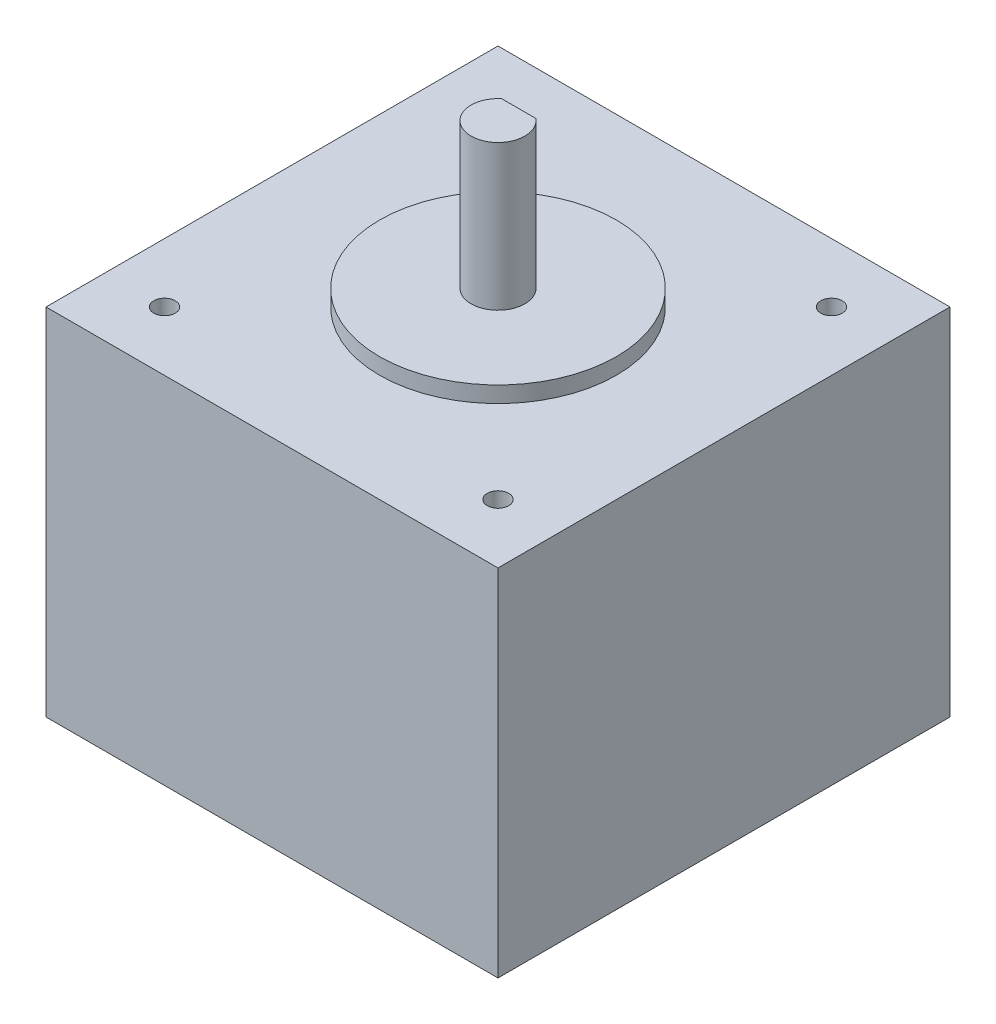
ISO-10303-21;
HEADER;
FILE_DESCRIPTION(('STEP AP214'),'2;1');
FILE_NAME('part.step','',(''),(''),'','','');
FILE_SCHEMA(('AUTOMOTIVE_DESIGN { 1 0 10303 214 1 1 1 1 }'));
ENDSEC;
DATA;
#1=APPLICATION_CONTEXT('core data for automotive mechanical design processes');
#2=APPLICATION_PROTOCOL_DEFINITION('international standard','automotive_design',2000,#1);
#3=PRODUCT_CONTEXT('',#1,'mechanical');
#4=PRODUCT('Part','Part','',(#3));
#5=PRODUCT_RELATED_PRODUCT_CATEGORY('part','',(#4));
#6=PRODUCT_DEFINITION_FORMATION('','',#4);
#7=PRODUCT_DEFINITION_CONTEXT('part definition',#1,'design');
#8=PRODUCT_DEFINITION('design','',#6,#7);
#9=PRODUCT_DEFINITION_SHAPE('','',#8);
#10=(LENGTH_UNIT() NAMED_UNIT(*) SI_UNIT(.MILLI.,.METRE.));
#11=(NAMED_UNIT(*) PLANE_ANGLE_UNIT() SI_UNIT($,.RADIAN.));
#12=(NAMED_UNIT(*) SI_UNIT($,.STERADIAN.) SOLID_ANGLE_UNIT());
#13=UNCERTAINTY_MEASURE_WITH_UNIT(LENGTH_MEASURE(1.E-05),#10,'distance_accuracy_value','');
#14=(GEOMETRIC_REPRESENTATION_CONTEXT(3) GLOBAL_UNCERTAINTY_ASSIGNED_CONTEXT((#13)) GLOBAL_UNIT_ASSIGNED_CONTEXT((#10,
#11,#12)) REPRESENTATION_CONTEXT('',''));
#15=CARTESIAN_POINT('',(0.,0.,0.));
#16=DIRECTION('',(0.,0.,1.));
#17=DIRECTION('',(1.,0.,0.));
#18=AXIS2_PLACEMENT_3D('',#15,#16,#17);
#19=CARTESIAN_POINT('',(0.,33.,0.));
#20=DIRECTION('',(1.,0.,0.));
#21=DIRECTION('',(0.,0.,-1.));
#22=AXIS2_PLACEMENT_3D('',#19,#20,#21);
#23=PLANE('',#22);
#24=DIRECTION('',(0.,0.,1.));
#25=VECTOR('',#24,1.);
#26=CARTESIAN_POINT('',(0.,0.,0.));
#27=LINE('',#26,#25);
#28=CARTESIAN_POINT('',(0.,0.,-42.));
#29=VERTEX_POINT('',#28);
#30=CARTESIAN_POINT('',(0.,0.,0.));
#31=VERTEX_POINT('',#30);
#32=EDGE_CURVE('E138',#29,#31,#27,.T.);
#33=ORIENTED_EDGE('',*,*,#32,.T.);
#34=DIRECTION('',(0.,-1.,0.));
#35=VECTOR('',#34,1.);
#36=CARTESIAN_POINT('',(0.,33.,0.));
#37=LINE('',#36,#35);
#38=CARTESIAN_POINT('',(0.,33.,0.));
#39=VERTEX_POINT('',#38);
#40=EDGE_CURVE('E160',#39,#31,#37,.T.);
#41=ORIENTED_EDGE('',*,*,#40,.F.);
#42=DIRECTION('',(0.,0.,1.));
#43=VECTOR('',#42,1.);
#44=CARTESIAN_POINT('',(0.,33.,0.));
#45=LINE('',#44,#43);
#46=CARTESIAN_POINT('',(0.,33.,-42.));
#47=VERTEX_POINT('',#46);
#48=EDGE_CURVE('E141',#47,#39,#45,.T.);
#49=ORIENTED_EDGE('',*,*,#48,.F.);
#50=DIRECTION('',(0.,-1.,0.));
#51=VECTOR('',#50,1.);
#52=CARTESIAN_POINT('',(0.,33.,-42.));
#53=LINE('',#52,#51);
#54=EDGE_CURVE('E147',#47,#29,#53,.T.);
#55=ORIENTED_EDGE('',*,*,#54,.T.);
#56=EDGE_LOOP('',(#33,#41,#49,#55));
#57=FACE_BOUND('',#56,.T.);
#58=ADVANCED_FACE('F33',(#57),#23,.F.);
#59=CARTESIAN_POINT('',(0.,33.,0.));
#60=DIRECTION('',(0.,0.,-1.));
#61=DIRECTION('',(-1.,0.,0.));
#62=AXIS2_PLACEMENT_3D('',#59,#60,#61);
#63=PLANE('',#62);
#64=DIRECTION('',(1.,0.,0.));
#65=VECTOR('',#64,1.);
#66=CARTESIAN_POINT('',(0.,0.,0.));
#67=LINE('',#66,#65);
#68=CARTESIAN_POINT('',(42.,0.,0.));
#69=VERTEX_POINT('',#68);
#70=EDGE_CURVE('E150',#31,#69,#67,.T.);
#71=ORIENTED_EDGE('',*,*,#70,.T.);
#72=DIRECTION('',(0.,-1.,0.));
#73=VECTOR('',#72,1.);
#74=CARTESIAN_POINT('',(42.,33.,0.));
#75=LINE('',#74,#73);
#76=CARTESIAN_POINT('',(42.,33.,0.));
#77=VERTEX_POINT('',#76);
#78=EDGE_CURVE('E158',#77,#69,#75,.T.);
#79=ORIENTED_EDGE('',*,*,#78,.F.);
#80=DIRECTION('',(1.,0.,0.));
#81=VECTOR('',#80,1.);
#82=CARTESIAN_POINT('',(0.,33.,0.));
#83=LINE('',#82,#81);
#84=EDGE_CURVE('E86',#39,#77,#83,.T.);
#85=ORIENTED_EDGE('',*,*,#84,.F.);
#86=ORIENTED_EDGE('',*,*,#40,.T.);
#87=EDGE_LOOP('',(#71,#79,#85,#86));
#88=FACE_BOUND('',#87,.T.);
#89=ADVANCED_FACE('F185',(#88),#63,.F.);
#90=CARTESIAN_POINT('',(42.,33.,0.));
#91=DIRECTION('',(-1.,0.,0.));
#92=DIRECTION('',(0.,0.,1.));
#93=AXIS2_PLACEMENT_3D('',#90,#91,#92);
#94=PLANE('',#93);
#95=DIRECTION('',(0.,0.,-1.));
#96=VECTOR('',#95,1.);
#97=CARTESIAN_POINT('',(42.,0.,0.));
#98=LINE('',#97,#96);
#99=CARTESIAN_POINT('',(42.,0.,-42.));
#100=VERTEX_POINT('',#99);
#101=EDGE_CURVE('E152',#69,#100,#98,.T.);
#102=ORIENTED_EDGE('',*,*,#101,.T.);
#103=DIRECTION('',(0.,-1.,0.));
#104=VECTOR('',#103,1.);
#105=CARTESIAN_POINT('',(42.,33.,-42.));
#106=LINE('',#105,#104);
#107=CARTESIAN_POINT('',(42.,33.,-42.));
#108=VERTEX_POINT('',#107);
#109=EDGE_CURVE('E156',#108,#100,#106,.T.);
#110=ORIENTED_EDGE('',*,*,#109,.F.);
#111=DIRECTION('',(0.,0.,-1.));
#112=VECTOR('',#111,1.);
#113=CARTESIAN_POINT('',(42.,33.,0.));
#114=LINE('',#113,#112);
#115=EDGE_CURVE('E144',#77,#108,#114,.T.);
#116=ORIENTED_EDGE('',*,*,#115,.F.);
#117=ORIENTED_EDGE('',*,*,#78,.T.);
#118=EDGE_LOOP('',(#102,#110,#116,#117));
#119=FACE_BOUND('',#118,.T.);
#120=ADVANCED_FACE('F188',(#119),#94,.F.);
#121=CARTESIAN_POINT('',(0.,33.,-42.));
#122=DIRECTION('',(0.,0.,1.));
#123=DIRECTION('',(1.,0.,0.));
#124=AXIS2_PLACEMENT_3D('',#121,#122,#123);
#125=PLANE('',#124);
#126=DIRECTION('',(-1.,0.,0.));
#127=VECTOR('',#126,1.);
#128=CARTESIAN_POINT('',(0.,0.,-42.));
#129=LINE('',#128,#127);
#130=EDGE_CURVE('E78',#100,#29,#129,.T.);
#131=ORIENTED_EDGE('',*,*,#130,.T.);
#132=ORIENTED_EDGE('',*,*,#54,.F.);
#133=DIRECTION('',(-1.,0.,0.));
#134=VECTOR('',#133,1.);
#135=CARTESIAN_POINT('',(0.,33.,-42.));
#136=LINE('',#135,#134);
#137=EDGE_CURVE('E57',#108,#47,#136,.T.);
#138=ORIENTED_EDGE('',*,*,#137,.F.);
#139=ORIENTED_EDGE('',*,*,#109,.T.);
#140=EDGE_LOOP('',(#131,#132,#138,#139));
#141=FACE_BOUND('',#140,.T.);
#142=ADVANCED_FACE('F171',(#141),#125,.F.);
#143=CARTESIAN_POINT('',(0.,33.,0.));
#144=DIRECTION('',(0.,-1.,0.));
#145=DIRECTION('',(0.,0.,-1.));
#146=AXIS2_PLACEMENT_3D('',#143,#144,#145);
#147=PLANE('',#146);
#148=CARTESIAN_POINT('',(21.,33.,-21.));
#149=DIRECTION('',(0.,-1.,0.));
#150=DIRECTION('',(0.,0.,-1.));
#151=AXIS2_PLACEMENT_3D('',#148,#149,#150);
#152=CIRCLE('',#151,11.);
#153=CARTESIAN_POINT('',(21.,33.,-32.));
#154=VERTEX_POINT('',#153);
#155=EDGE_CURVE('E36',#154,#154,#152,.F.);
#156=ORIENTED_EDGE('',*,*,#155,.F.);
#157=EDGE_LOOP('',(#156));
#158=FACE_BOUND('',#157,.T.);
#159=CARTESIAN_POINT('',(5.50499999999999,33.,-5.505));
#160=DIRECTION('',(0.,1.,0.));
#161=DIRECTION('',(0.,0.,1.));
#162=AXIS2_PLACEMENT_3D('',#159,#160,#161);
#163=CIRCLE('',#162,1.);
#164=CARTESIAN_POINT('',(5.50499999999999,33.,-4.505));
#165=VERTEX_POINT('',#164);
#166=EDGE_CURVE('E112',#165,#165,#163,.T.);
#167=ORIENTED_EDGE('',*,*,#166,.F.);
#168=EDGE_LOOP('',(#167));
#169=FACE_BOUND('',#168,.T.);
#170=CARTESIAN_POINT('',(36.495,33.,-5.505));
#171=DIRECTION('',(0.,1.,0.));
#172=DIRECTION('',(0.,0.,1.));
#173=AXIS2_PLACEMENT_3D('',#170,#171,#172);
#174=CIRCLE('',#173,0.999999999999998);
#175=CARTESIAN_POINT('',(36.495,33.,-4.505));
#176=VERTEX_POINT('',#175);
#177=EDGE_CURVE('E127',#176,#176,#174,.T.);
#178=ORIENTED_EDGE('',*,*,#177,.F.);
#179=EDGE_LOOP('',(#178));
#180=FACE_BOUND('',#179,.T.);
#181=CARTESIAN_POINT('',(36.495,33.,-36.495));
#182=DIRECTION('',(0.,1.,0.));
#183=DIRECTION('',(0.,0.,1.));
#184=AXIS2_PLACEMENT_3D('',#181,#182,#183);
#185=CIRCLE('',#184,0.999999999999998);
#186=CARTESIAN_POINT('',(36.495,33.,-35.495));
#187=VERTEX_POINT('',#186);
#188=EDGE_CURVE('E121',#187,#187,#185,.T.);
#189=ORIENTED_EDGE('',*,*,#188,.F.);
#190=EDGE_LOOP('',(#189));
#191=FACE_BOUND('',#190,.T.);
#192=CARTESIAN_POINT('',(5.50499999999999,33.,-36.495));
#193=DIRECTION('',(0.,1.,0.));
#194=DIRECTION('',(0.,0.,1.));
#195=AXIS2_PLACEMENT_3D('',#192,#193,#194);
#196=CIRCLE('',#195,1.);
#197=CARTESIAN_POINT('',(5.50499999999999,33.,-35.495));
#198=VERTEX_POINT('',#197);
#199=EDGE_CURVE('E120',#198,#198,#196,.T.);
#200=ORIENTED_EDGE('',*,*,#199,.F.);
#201=EDGE_LOOP('',(#200));
#202=FACE_BOUND('',#201,.T.);
#203=ORIENTED_EDGE('',*,*,#48,.T.);
#204=ORIENTED_EDGE('',*,*,#84,.T.);
#205=ORIENTED_EDGE('',*,*,#115,.T.);
#206=ORIENTED_EDGE('',*,*,#137,.T.);
#207=EDGE_LOOP('',(#203,#204,#205,#206));
#208=FACE_BOUND('',#207,.T.);
#209=ADVANCED_FACE('F167',(#158,#169,#180,#191,#202,#208),#147,.F.);
#210=CARTESIAN_POINT('',(0.,0.,0.));
#211=DIRECTION('',(0.,-1.,0.));
#212=DIRECTION('',(0.,0.,-1.));
#213=AXIS2_PLACEMENT_3D('',#210,#211,#212);
#214=PLANE('',#213);
#215=ORIENTED_EDGE('',*,*,#32,.F.);
#216=ORIENTED_EDGE('',*,*,#130,.F.);
#217=ORIENTED_EDGE('',*,*,#101,.F.);
#218=ORIENTED_EDGE('',*,*,#70,.F.);
#219=EDGE_LOOP('',(#215,#216,#217,#218));
#220=FACE_BOUND('',#219,.T.);
#221=ADVANCED_FACE('F170',(#220),#214,.T.);
#222=CARTESIAN_POINT('',(5.50499999999999,29.5,-36.495));
#223=DIRECTION('',(0.,1.,0.));
#224=DIRECTION('',(0.,0.,1.));
#225=AXIS2_PLACEMENT_3D('',#222,#223,#224);
#226=CYLINDRICAL_SURFACE('',#225,1.);
#227=CARTESIAN_POINT('',(5.50499999999999,29.5,-36.495));
#228=DIRECTION('',(0.,1.,0.));
#229=DIRECTION('',(0.,0.,1.));
#230=AXIS2_PLACEMENT_3D('',#227,#228,#229);
#231=CIRCLE('',#230,1.);
#232=CARTESIAN_POINT('',(5.50499999999999,29.5,-35.495));
#233=VERTEX_POINT('',#232);
#234=EDGE_CURVE('E135',#233,#233,#231,.T.);
#235=ORIENTED_EDGE('',*,*,#234,.F.);
#236=EDGE_LOOP('',(#235));
#237=FACE_BOUND('',#236,.T.);
#238=ORIENTED_EDGE('',*,*,#199,.T.);
#239=EDGE_LOOP('',(#238));
#240=FACE_BOUND('',#239,.T.);
#241=ADVANCED_FACE('F221',(#237,#240),#226,.F.);
#242=CARTESIAN_POINT('',(5.50499999999999,29.5,-36.495));
#243=DIRECTION('',(0.,1.,0.));
#244=DIRECTION('',(0.,0.,1.));
#245=AXIS2_PLACEMENT_3D('',#242,#243,#244);
#246=PLANE('',#245);
#247=ORIENTED_EDGE('',*,*,#234,.T.);
#248=EDGE_LOOP('',(#247));
#249=FACE_BOUND('',#248,.T.);
#250=ADVANCED_FACE('F229',(#249),#246,.T.);
#251=CARTESIAN_POINT('',(36.495,29.5,-36.495));
#252=DIRECTION('',(0.,1.,0.));
#253=DIRECTION('',(0.,0.,1.));
#254=AXIS2_PLACEMENT_3D('',#251,#252,#253);
#255=CYLINDRICAL_SURFACE('',#254,0.999999999999998);
#256=CARTESIAN_POINT('',(36.495,29.5,-36.495));
#257=DIRECTION('',(0.,1.,0.));
#258=DIRECTION('',(0.,0.,1.));
#259=AXIS2_PLACEMENT_3D('',#256,#257,#258);
#260=CIRCLE('',#259,0.999999999999998);
#261=CARTESIAN_POINT('',(36.495,29.5,-35.495));
#262=VERTEX_POINT('',#261);
#263=EDGE_CURVE('E117',#262,#262,#260,.T.);
#264=ORIENTED_EDGE('',*,*,#263,.F.);
#265=EDGE_LOOP('',(#264));
#266=FACE_BOUND('',#265,.T.);
#267=ORIENTED_EDGE('',*,*,#188,.T.);
#268=EDGE_LOOP('',(#267));
#269=FACE_BOUND('',#268,.T.);
#270=ADVANCED_FACE('F239',(#266,#269),#255,.F.);
#271=CARTESIAN_POINT('',(36.495,29.5,-36.495));
#272=DIRECTION('',(0.,1.,0.));
#273=DIRECTION('',(0.,0.,1.));
#274=AXIS2_PLACEMENT_3D('',#271,#272,#273);
#275=PLANE('',#274);
#276=ORIENTED_EDGE('',*,*,#263,.T.);
#277=EDGE_LOOP('',(#276));
#278=FACE_BOUND('',#277,.T.);
#279=ADVANCED_FACE('F249',(#278),#275,.T.);
#280=CARTESIAN_POINT('',(36.495,29.5,-5.505));
#281=DIRECTION('',(0.,1.,0.));
#282=DIRECTION('',(0.,0.,1.));
#283=AXIS2_PLACEMENT_3D('',#280,#281,#282);
#284=CYLINDRICAL_SURFACE('',#283,0.999999999999998);
#285=CARTESIAN_POINT('',(36.495,29.5,-5.505));
#286=DIRECTION('',(0.,1.,0.));
#287=DIRECTION('',(0.,0.,1.));
#288=AXIS2_PLACEMENT_3D('',#285,#286,#287);
#289=CIRCLE('',#288,0.999999999999998);
#290=CARTESIAN_POINT('',(36.495,29.5,-4.505));
#291=VERTEX_POINT('',#290);
#292=EDGE_CURVE('E124',#291,#291,#289,.T.);
#293=ORIENTED_EDGE('',*,*,#292,.F.);
#294=EDGE_LOOP('',(#293));
#295=FACE_BOUND('',#294,.T.);
#296=ORIENTED_EDGE('',*,*,#177,.T.);
#297=EDGE_LOOP('',(#296));
#298=FACE_BOUND('',#297,.T.);
#299=ADVANCED_FACE('F259',(#295,#298),#284,.F.);
#300=CARTESIAN_POINT('',(36.495,29.5,-5.505));
#301=DIRECTION('',(0.,1.,0.));
#302=DIRECTION('',(0.,0.,1.));
#303=AXIS2_PLACEMENT_3D('',#300,#301,#302);
#304=PLANE('',#303);
#305=ORIENTED_EDGE('',*,*,#292,.T.);
#306=EDGE_LOOP('',(#305));
#307=FACE_BOUND('',#306,.T.);
#308=ADVANCED_FACE('F269',(#307),#304,.T.);
#309=CARTESIAN_POINT('',(5.50499999999999,29.5,-5.505));
#310=DIRECTION('',(0.,1.,0.));
#311=DIRECTION('',(0.,0.,1.));
#312=AXIS2_PLACEMENT_3D('',#309,#310,#311);
#313=CYLINDRICAL_SURFACE('',#312,1.);
#314=CARTESIAN_POINT('',(5.50499999999999,29.5,-5.505));
#315=DIRECTION('',(0.,1.,0.));
#316=DIRECTION('',(0.,0.,1.));
#317=AXIS2_PLACEMENT_3D('',#314,#315,#316);
#318=CIRCLE('',#317,1.);
#319=CARTESIAN_POINT('',(5.50499999999999,29.5,-4.505));
#320=VERTEX_POINT('',#319);
#321=EDGE_CURVE('E130',#320,#320,#318,.T.);
#322=ORIENTED_EDGE('',*,*,#321,.F.);
#323=EDGE_LOOP('',(#322));
#324=FACE_BOUND('',#323,.T.);
#325=ORIENTED_EDGE('',*,*,#166,.T.);
#326=EDGE_LOOP('',(#325));
#327=FACE_BOUND('',#326,.T.);
#328=ADVANCED_FACE('F279',(#324,#327),#313,.F.);
#329=CARTESIAN_POINT('',(5.50499999999999,29.5,-5.505));
#330=DIRECTION('',(0.,1.,0.));
#331=DIRECTION('',(0.,0.,1.));
#332=AXIS2_PLACEMENT_3D('',#329,#330,#331);
#333=PLANE('',#332);
#334=ORIENTED_EDGE('',*,*,#321,.T.);
#335=EDGE_LOOP('',(#334));
#336=FACE_BOUND('',#335,.T.);
#337=ADVANCED_FACE('F289',(#336),#333,.T.);
#338=CARTESIAN_POINT('',(21.,34.5,-21.));
#339=DIRECTION('',(0.,-1.,0.));
#340=DIRECTION('',(0.,0.,-1.));
#341=AXIS2_PLACEMENT_3D('',#338,#339,#340);
#342=CYLINDRICAL_SURFACE('',#341,11.);
#343=CARTESIAN_POINT('',(21.,34.5,-21.));
#344=DIRECTION('',(0.,1.,0.));
#345=DIRECTION('',(0.,0.,1.));
#346=AXIS2_PLACEMENT_3D('',#343,#344,#345);
#347=CIRCLE('',#346,11.);
#348=CARTESIAN_POINT('',(21.,34.5,-10.));
#349=VERTEX_POINT('',#348);
#350=EDGE_CURVE('E109',#349,#349,#347,.T.);
#351=ORIENTED_EDGE('',*,*,#350,.F.);
#352=EDGE_LOOP('',(#351));
#353=FACE_BOUND('',#352,.T.);
#354=ORIENTED_EDGE('',*,*,#155,.T.);
#355=EDGE_LOOP('',(#354));
#356=FACE_BOUND('',#355,.T.);
#357=ADVANCED_FACE('F165',(#353,#356),#342,.T.);
#358=CARTESIAN_POINT('',(21.,34.5,-21.));
#359=DIRECTION('',(0.,1.,0.));
#360=DIRECTION('',(0.,0.,1.));
#361=AXIS2_PLACEMENT_3D('',#358,#359,#360);
#362=PLANE('',#361);
#363=CARTESIAN_POINT('',(21.,34.5,-21.));
#364=DIRECTION('',(0.,1.,0.));
#365=DIRECTION('',(0.,0.,1.));
#366=AXIS2_PLACEMENT_3D('',#363,#364,#365);
#367=CIRCLE('',#366,2.5);
#368=CARTESIAN_POINT('',(19.4109436762657,34.5,-22.93));
#369=VERTEX_POINT('',#368);
#370=CARTESIAN_POINT('',(22.5890563237343,34.5,-22.93));
#371=VERTEX_POINT('',#370);
#372=EDGE_CURVE('E11',#369,#371,#367,.T.);
#373=ORIENTED_EDGE('',*,*,#372,.F.);
#374=DIRECTION('',(-1.,0.,0.));
#375=VECTOR('',#374,1.);
#376=CARTESIAN_POINT('',(0.,34.5,-22.93));
#377=LINE('',#376,#375);
#378=EDGE_CURVE('E106',#371,#369,#377,.T.);
#379=ORIENTED_EDGE('',*,*,#378,.F.);
#380=EDGE_LOOP('',(#373,#379));
#381=FACE_BOUND('',#380,.T.);
#382=ORIENTED_EDGE('',*,*,#350,.T.);
#383=EDGE_LOOP('',(#382));
#384=FACE_BOUND('',#383,.T.);
#385=ADVANCED_FACE('F313',(#381,#384),#362,.T.);
#386=CARTESIAN_POINT('',(21.,48.,-21.));
#387=DIRECTION('',(0.,-1.,0.));
#388=DIRECTION('',(0.,0.,-1.));
#389=AXIS2_PLACEMENT_3D('',#386,#387,#388);
#390=CYLINDRICAL_SURFACE('',#389,2.5);
#391=CARTESIAN_POINT('',(21.,48.,-21.));
#392=DIRECTION('',(0.,1.,0.));
#393=DIRECTION('',(0.,0.,1.));
#394=AXIS2_PLACEMENT_3D('',#391,#392,#393);
#395=CIRCLE('',#394,2.5);
#396=CARTESIAN_POINT('',(19.4109436762657,48.,-22.93));
#397=VERTEX_POINT('',#396);
#398=CARTESIAN_POINT('',(22.5890563237343,48.,-22.93));
#399=VERTEX_POINT('',#398);
#400=EDGE_CURVE('E104',#397,#399,#395,.T.);
#401=ORIENTED_EDGE('',*,*,#400,.F.);
#402=DIRECTION('',(0.,1.,0.));
#403=VECTOR('',#402,1.);
#404=CARTESIAN_POINT('',(19.4109436762657,31.2711766849207,-22.93));
#405=LINE('',#404,#403);
#406=EDGE_CURVE('E48',#369,#397,#405,.T.);
#407=ORIENTED_EDGE('',*,*,#406,.F.);
#408=ORIENTED_EDGE('',*,*,#372,.T.);
#409=DIRECTION('',(0.,1.,0.));
#410=VECTOR('',#409,1.);
#411=CARTESIAN_POINT('',(22.5890563237343,31.2711766849207,-22.93));
#412=LINE('',#411,#410);
#413=EDGE_CURVE('E96',#371,#399,#412,.T.);
#414=ORIENTED_EDGE('',*,*,#413,.T.);
#415=EDGE_LOOP('',(#401,#407,#408,#414));
#416=FACE_BOUND('',#415,.T.);
#417=ADVANCED_FACE('F103',(#416),#390,.T.);
#418=CARTESIAN_POINT('',(21.,48.,-21.));
#419=DIRECTION('',(0.,1.,0.));
#420=DIRECTION('',(0.,0.,1.));
#421=AXIS2_PLACEMENT_3D('',#418,#419,#420);
#422=PLANE('',#421);
#423=DIRECTION('',(1.,0.,0.));
#424=VECTOR('',#423,1.);
#425=CARTESIAN_POINT('',(0.,48.,-22.93));
#426=LINE('',#425,#424);
#427=EDGE_CURVE('E93',#397,#399,#426,.T.);
#428=ORIENTED_EDGE('',*,*,#427,.F.);
#429=ORIENTED_EDGE('',*,*,#400,.T.);
#430=EDGE_LOOP('',(#428,#429));
#431=FACE_BOUND('',#430,.T.);
#432=ADVANCED_FACE('F108',(#431),#422,.T.);
#433=CARTESIAN_POINT('',(0.,31.2711766849207,-22.93));
#434=DIRECTION('',(0.,0.,1.));
#435=DIRECTION('',(1.,0.,0.));
#436=AXIS2_PLACEMENT_3D('',#433,#434,#435);
#437=PLANE('',#436);
#438=ORIENTED_EDGE('',*,*,#378,.T.);
#439=ORIENTED_EDGE('',*,*,#406,.T.);
#440=ORIENTED_EDGE('',*,*,#427,.T.);
#441=ORIENTED_EDGE('',*,*,#413,.F.);
#442=EDGE_LOOP('',(#438,#439,#440,#441));
#443=FACE_BOUND('',#442,.T.);
#444=ADVANCED_FACE('F95',(#443),#437,.F.);
#445=CLOSED_SHELL('',(#58,#89,#120,#142,#209,#221,#241,#250,#270,#279,#299,#308,#328,#337,#357,
#385,#417,#432,#444));
#446=MANIFOLD_SOLID_BREP('B2',#445);
#447=ADVANCED_BREP_SHAPE_REPRESENTATION('',(#18,#446),#14);
#448=SHAPE_DEFINITION_REPRESENTATION(#9,#447);
ENDSEC;
END-ISO-10303-21;
